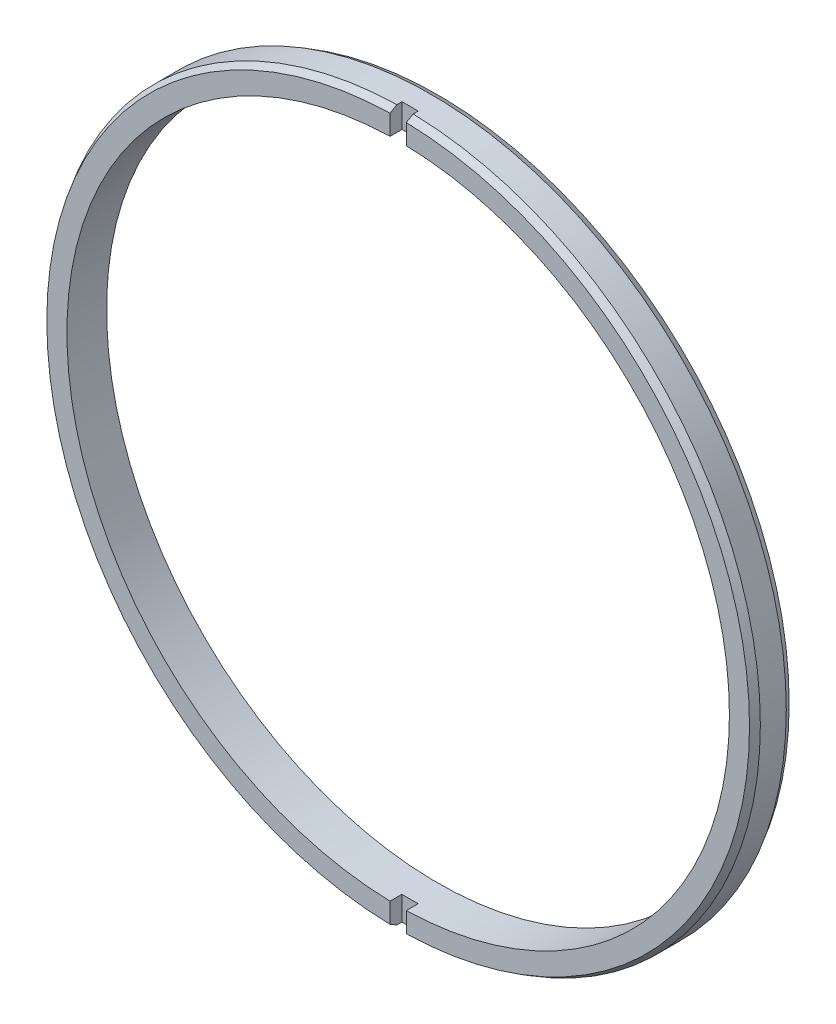
ISO-10303-21;
HEADER;
FILE_DESCRIPTION(('STEP AP214'),'2;1');
FILE_NAME('part.step','',(''),(''),'','','');
FILE_SCHEMA(('AUTOMOTIVE_DESIGN { 1 0 10303 214 1 1 1 1 }'));
ENDSEC;
DATA;
#1=APPLICATION_CONTEXT('core data for automotive mechanical design processes');
#2=APPLICATION_PROTOCOL_DEFINITION('international standard','automotive_design',2000,#1);
#3=PRODUCT_CONTEXT('',#1,'mechanical');
#4=PRODUCT('Part','Part','',(#3));
#5=PRODUCT_RELATED_PRODUCT_CATEGORY('part','',(#4));
#6=PRODUCT_DEFINITION_FORMATION('','',#4);
#7=PRODUCT_DEFINITION_CONTEXT('part definition',#1,'design');
#8=PRODUCT_DEFINITION('design','',#6,#7);
#9=PRODUCT_DEFINITION_SHAPE('','',#8);
#10=(LENGTH_UNIT() NAMED_UNIT(*) SI_UNIT(.MILLI.,.METRE.));
#11=(NAMED_UNIT(*) PLANE_ANGLE_UNIT() SI_UNIT($,.RADIAN.));
#12=(NAMED_UNIT(*) SI_UNIT($,.STERADIAN.) SOLID_ANGLE_UNIT());
#13=UNCERTAINTY_MEASURE_WITH_UNIT(LENGTH_MEASURE(1.E-05),#10,'distance_accuracy_value','');
#14=(GEOMETRIC_REPRESENTATION_CONTEXT(3) GLOBAL_UNCERTAINTY_ASSIGNED_CONTEXT((#13)) GLOBAL_UNIT_ASSIGNED_CONTEXT((#10,
#11,#12)) REPRESENTATION_CONTEXT('',''));
#15=CARTESIAN_POINT('',(0.,0.,0.));
#16=DIRECTION('',(0.,0.,1.));
#17=DIRECTION('',(1.,0.,0.));
#18=AXIS2_PLACEMENT_3D('',#15,#16,#17);
#19=CARTESIAN_POINT('',(0.,0.,0.));
#20=DIRECTION('',(0.,0.,1.));
#21=DIRECTION('',(1.,0.,0.));
#22=AXIS2_PLACEMENT_3D('',#19,#20,#21);
#23=PLANE('',#22);
#24=DIRECTION('',(0.,1.,0.));
#25=VECTOR('',#24,1.);
#26=CARTESIAN_POINT('',(0.5207,22.9971254303368,0.));
#27=LINE('',#26,#25);
#28=CARTESIAN_POINT('',(0.520700000000006,-22.4899730437811,0.));
#29=VERTEX_POINT('',#28);
#30=CARTESIAN_POINT('',(0.520700000000005,-21.2026072101994,0.));
#31=VERTEX_POINT('',#30);
#32=EDGE_CURVE('E247',#29,#31,#27,.T.);
#33=ORIENTED_EDGE('',*,*,#32,.F.);
#34=CARTESIAN_POINT('',(0.,0.,0.));
#35=DIRECTION('',(0.,0.,1.));
#36=DIRECTION('',(1.,0.,0.));
#37=AXIS2_PLACEMENT_3D('',#34,#35,#36);
#38=CIRCLE('',#37,22.496);
#39=CARTESIAN_POINT('',(0.5207,22.4899730437811,0.));
#40=VERTEX_POINT('',#39);
#41=EDGE_CURVE('E135',#29,#40,#38,.T.);
#42=ORIENTED_EDGE('',*,*,#41,.T.);
#43=CARTESIAN_POINT('',(0.5207,21.2026072101994,0.));
#44=VERTEX_POINT('',#43);
#45=EDGE_CURVE('E101',#44,#40,#27,.T.);
#46=ORIENTED_EDGE('',*,*,#45,.F.);
#47=CARTESIAN_POINT('',(0.,0.,0.));
#48=DIRECTION('',(0.,0.,1.));
#49=DIRECTION('',(1.,0.,0.));
#50=AXIS2_PLACEMENT_3D('',#47,#48,#49);
#51=CIRCLE('',#50,21.209);
#52=EDGE_CURVE('E119',#31,#44,#51,.T.);
#53=ORIENTED_EDGE('',*,*,#52,.F.);
#54=EDGE_LOOP('',(#33,#42,#46,#53));
#55=FACE_BOUND('',#54,.T.);
#56=ADVANCED_FACE('F16',(#55),#23,.T.);
#57=CARTESIAN_POINT('',(0.,0.,-2.54));
#58=DIRECTION('',(0.,0.,1.));
#59=DIRECTION('',(1.,0.,0.));
#60=AXIS2_PLACEMENT_3D('',#57,#58,#59);
#61=CYLINDRICAL_SURFACE('',#60,22.75);
#62=CARTESIAN_POINT('',(0.,0.,-2.10005909487751));
#63=DIRECTION('',(0.,0.,1.));
#64=DIRECTION('',(1.,0.,0.));
#65=AXIS2_PLACEMENT_3D('',#62,#63,#64);
#66=CIRCLE('',#65,22.75);
#67=CARTESIAN_POINT('',(22.75,0.,-2.10005909487751));
#68=VERTEX_POINT('',#67);
#69=EDGE_CURVE('E24',#68,#68,#66,.T.);
#70=ORIENTED_EDGE('',*,*,#69,.T.);
#71=EDGE_LOOP('',(#70));
#72=FACE_BOUND('',#71,.T.);
#73=DIRECTION('',(0.,0.,1.));
#74=VECTOR('',#73,1.);
#75=CARTESIAN_POINT('',(0.5207,22.7440403514855,-2.54));
#76=LINE('',#75,#74);
#77=CARTESIAN_POINT('',(0.5207,22.7440403514855,-0.439940905122491));
#78=VERTEX_POINT('',#77);
#79=CARTESIAN_POINT('',(0.5207,22.7440403514855,-0.762));
#80=VERTEX_POINT('',#79);
#81=EDGE_CURVE('E124',#78,#80,#76,.F.);
#82=ORIENTED_EDGE('',*,*,#81,.F.);
#83=CARTESIAN_POINT('',(0.,0.,-0.439940905122491));
#84=DIRECTION('',(0.,0.,1.));
#85=DIRECTION('',(1.,0.,0.));
#86=AXIS2_PLACEMENT_3D('',#83,#84,#85);
#87=CIRCLE('',#86,22.75);
#88=CARTESIAN_POINT('',(0.520700000000005,-22.7440403514855,-0.439940905122486));
#89=VERTEX_POINT('',#88);
#90=EDGE_CURVE('E171',#78,#89,#87,.F.);
#91=ORIENTED_EDGE('',*,*,#90,.T.);
#92=DIRECTION('',(0.,0.,1.));
#93=VECTOR('',#92,1.);
#94=CARTESIAN_POINT('',(0.520700000000005,-22.7440403514855,-2.54));
#95=LINE('',#94,#93);
#96=CARTESIAN_POINT('',(0.520700000000006,-22.7440403514855,-0.762));
#97=VERTEX_POINT('',#96);
#98=EDGE_CURVE('E229',#97,#89,#95,.T.);
#99=ORIENTED_EDGE('',*,*,#98,.F.);
#100=CARTESIAN_POINT('',(0.,0.,-0.762));
#101=DIRECTION('',(0.,0.,1.));
#102=DIRECTION('',(1.,0.,0.));
#103=AXIS2_PLACEMENT_3D('',#100,#101,#102);
#104=CIRCLE('',#103,22.75);
#105=CARTESIAN_POINT('',(-0.520699999999994,-22.7440403514855,-0.762));
#106=VERTEX_POINT('',#105);
#107=EDGE_CURVE('E237',#97,#106,#104,.F.);
#108=ORIENTED_EDGE('',*,*,#107,.T.);
#109=DIRECTION('',(0.,0.,1.));
#110=VECTOR('',#109,1.);
#111=CARTESIAN_POINT('',(-0.520699999999994,-22.7440403514855,-2.54));
#112=LINE('',#111,#110);
#113=CARTESIAN_POINT('',(-0.520699999999994,-22.7440403514855,-0.439940905122491));
#114=VERTEX_POINT('',#113);
#115=EDGE_CURVE('E235',#114,#106,#112,.F.);
#116=ORIENTED_EDGE('',*,*,#115,.F.);
#117=CARTESIAN_POINT('',(0.,0.,-0.439940905122491));
#118=DIRECTION('',(0.,0.,1.));
#119=DIRECTION('',(1.,0.,0.));
#120=AXIS2_PLACEMENT_3D('',#117,#118,#119);
#121=CIRCLE('',#120,22.75);
#122=CARTESIAN_POINT('',(-0.5207,22.7440403514855,-0.439940905122486));
#123=VERTEX_POINT('',#122);
#124=EDGE_CURVE('E146',#114,#123,#121,.F.);
#125=ORIENTED_EDGE('',*,*,#124,.T.);
#126=DIRECTION('',(0.,0.,1.));
#127=VECTOR('',#126,1.);
#128=CARTESIAN_POINT('',(-0.5207,22.7440403514855,-2.54));
#129=LINE('',#128,#127);
#130=CARTESIAN_POINT('',(-0.5207,22.7440403514855,-0.762));
#131=VERTEX_POINT('',#130);
#132=EDGE_CURVE('E233',#131,#123,#129,.T.);
#133=ORIENTED_EDGE('',*,*,#132,.F.);
#134=EDGE_CURVE('E226',#131,#80,#104,.F.);
#135=ORIENTED_EDGE('',*,*,#134,.T.);
#136=EDGE_LOOP('',(#82,#91,#99,#108,#116,#125,#133,#135));
#137=FACE_BOUND('',#136,.T.);
#138=ADVANCED_FACE('F194',(#72,#137),#61,.T.);
#139=CARTESIAN_POINT('',(0.,0.,-2.54));
#140=DIRECTION('',(0.,0.,1.));
#141=DIRECTION('',(1.,0.,0.));
#142=AXIS2_PLACEMENT_3D('',#139,#140,#141);
#143=PLANE('',#142);
#144=CARTESIAN_POINT('',(0.,0.,-2.54));
#145=DIRECTION('',(0.,0.,1.));
#146=DIRECTION('',(1.,0.,0.));
#147=AXIS2_PLACEMENT_3D('',#144,#145,#146);
#148=CIRCLE('',#147,22.496);
#149=CARTESIAN_POINT('',(22.496,0.,-2.54));
#150=VERTEX_POINT('',#149);
#151=EDGE_CURVE('E11',#150,#150,#148,.F.);
#152=ORIENTED_EDGE('',*,*,#151,.T.);
#153=EDGE_LOOP('',(#152));
#154=FACE_BOUND('',#153,.T.);
#155=CARTESIAN_POINT('',(0.,0.,-2.54));
#156=DIRECTION('',(0.,0.,1.));
#157=DIRECTION('',(1.,0.,0.));
#158=AXIS2_PLACEMENT_3D('',#155,#156,#157);
#159=CIRCLE('',#158,21.209);
#160=CARTESIAN_POINT('',(21.209,0.,-2.54));
#161=VERTEX_POINT('',#160);
#162=EDGE_CURVE('E118',#161,#161,#159,.T.);
#163=ORIENTED_EDGE('',*,*,#162,.T.);
#164=EDGE_LOOP('',(#163));
#165=FACE_BOUND('',#164,.T.);
#166=ADVANCED_FACE('F200',(#154,#165),#143,.F.);
#167=DIRECTION('',(0.,-1.,0.));
#168=VECTOR('',#167,1.);
#169=CARTESIAN_POINT('',(-0.5207,22.9971254303368,0.));
#170=LINE('',#169,#168);
#171=CARTESIAN_POINT('',(-0.5207,22.4899730437811,0.));
#172=VERTEX_POINT('',#171);
#173=CARTESIAN_POINT('',(-0.5207,21.2026072101994,0.));
#174=VERTEX_POINT('',#173);
#175=EDGE_CURVE('E93',#172,#174,#170,.T.);
#176=ORIENTED_EDGE('',*,*,#175,.F.);
#177=CARTESIAN_POINT('',(0.,0.,0.));
#178=DIRECTION('',(0.,0.,1.));
#179=DIRECTION('',(1.,0.,0.));
#180=AXIS2_PLACEMENT_3D('',#177,#178,#179);
#181=CIRCLE('',#180,22.496);
#182=CARTESIAN_POINT('',(-0.520699999999994,-22.4899730437811,0.));
#183=VERTEX_POINT('',#182);
#184=EDGE_CURVE('E170',#172,#183,#181,.T.);
#185=ORIENTED_EDGE('',*,*,#184,.T.);
#186=CARTESIAN_POINT('',(-0.520699999999994,-21.2026072101994,0.));
#187=VERTEX_POINT('',#186);
#188=EDGE_CURVE('E102',#187,#183,#170,.T.);
#189=ORIENTED_EDGE('',*,*,#188,.F.);
#190=EDGE_CURVE('E110',#174,#187,#51,.T.);
#191=ORIENTED_EDGE('',*,*,#190,.F.);
#192=EDGE_LOOP('',(#176,#185,#189,#191));
#193=FACE_BOUND('',#192,.T.);
#194=ADVANCED_FACE('F116',(#193),#23,.T.);
#195=CARTESIAN_POINT('',(0.,0.,-2.54));
#196=DIRECTION('',(0.,0.,1.));
#197=DIRECTION('',(1.,0.,0.));
#198=AXIS2_PLACEMENT_3D('',#195,#196,#197);
#199=CYLINDRICAL_SURFACE('',#198,21.209);
#200=CARTESIAN_POINT('',(0.,0.,-0.762));
#201=DIRECTION('',(0.,0.,1.));
#202=DIRECTION('',(1.,0.,0.));
#203=AXIS2_PLACEMENT_3D('',#200,#201,#202);
#204=CIRCLE('',#203,21.209);
#205=CARTESIAN_POINT('',(0.520700000000005,-21.2026072101994,-0.762));
#206=VERTEX_POINT('',#205);
#207=CARTESIAN_POINT('',(-0.520699999999994,-21.2026072101994,-0.762));
#208=VERTEX_POINT('',#207);
#209=EDGE_CURVE('E127',#206,#208,#204,.F.);
#210=ORIENTED_EDGE('',*,*,#209,.F.);
#211=DIRECTION('',(0.,0.,1.));
#212=VECTOR('',#211,1.);
#213=CARTESIAN_POINT('',(0.520700000000005,-21.2026072101994,-2.54));
#214=LINE('',#213,#212);
#215=EDGE_CURVE('E132',#206,#31,#214,.T.);
#216=ORIENTED_EDGE('',*,*,#215,.T.);
#217=ORIENTED_EDGE('',*,*,#52,.T.);
#218=DIRECTION('',(0.,0.,1.));
#219=VECTOR('',#218,1.);
#220=CARTESIAN_POINT('',(0.5207,21.2026072101994,-2.54));
#221=LINE('',#220,#219);
#222=CARTESIAN_POINT('',(0.5207,21.2026072101994,-0.762));
#223=VERTEX_POINT('',#222);
#224=EDGE_CURVE('E113',#44,#223,#221,.F.);
#225=ORIENTED_EDGE('',*,*,#224,.T.);
#226=CARTESIAN_POINT('',(-0.5207,21.2026072101994,-0.762));
#227=VERTEX_POINT('',#226);
#228=EDGE_CURVE('E112',#227,#223,#204,.F.);
#229=ORIENTED_EDGE('',*,*,#228,.F.);
#230=DIRECTION('',(0.,0.,1.));
#231=VECTOR('',#230,1.);
#232=CARTESIAN_POINT('',(-0.520699999999999,21.2026072101994,-2.54));
#233=LINE('',#232,#231);
#234=EDGE_CURVE('E97',#227,#174,#233,.T.);
#235=ORIENTED_EDGE('',*,*,#234,.T.);
#236=ORIENTED_EDGE('',*,*,#190,.T.);
#237=DIRECTION('',(0.,0.,1.));
#238=VECTOR('',#237,1.);
#239=CARTESIAN_POINT('',(-0.520699999999994,-21.2026072101994,-2.54));
#240=LINE('',#239,#238);
#241=EDGE_CURVE('E130',#187,#208,#240,.F.);
#242=ORIENTED_EDGE('',*,*,#241,.T.);
#243=EDGE_LOOP('',(#210,#216,#217,#225,#229,#235,#236,#242));
#244=FACE_BOUND('',#243,.T.);
#245=ORIENTED_EDGE('',*,*,#162,.F.);
#246=EDGE_LOOP('',(#245));
#247=FACE_BOUND('',#246,.T.);
#248=ADVANCED_FACE('F107',(#244,#247),#199,.F.);
#249=CARTESIAN_POINT('',(-0.5207,22.9971254303368,-0.762));
#250=DIRECTION('',(0.,0.,1.));
#251=DIRECTION('',(1.,0.,0.));
#252=AXIS2_PLACEMENT_3D('',#249,#250,#251);
#253=PLANE('',#252);
#254=DIRECTION('',(0.,-1.,0.));
#255=VECTOR('',#254,1.);
#256=CARTESIAN_POINT('',(-0.5207,22.9971254303368,-0.762));
#257=LINE('',#256,#255);
#258=EDGE_CURVE('E236',#131,#227,#257,.T.);
#259=ORIENTED_EDGE('',*,*,#258,.T.);
#260=ORIENTED_EDGE('',*,*,#228,.T.);
#261=DIRECTION('',(0.,1.,0.));
#262=VECTOR('',#261,1.);
#263=CARTESIAN_POINT('',(0.5207,22.9971254303368,-0.762));
#264=LINE('',#263,#262);
#265=EDGE_CURVE('E243',#223,#80,#264,.T.);
#266=ORIENTED_EDGE('',*,*,#265,.T.);
#267=ORIENTED_EDGE('',*,*,#134,.F.);
#268=EDGE_LOOP('',(#259,#260,#266,#267));
#269=FACE_BOUND('',#268,.T.);
#270=ADVANCED_FACE('F209',(#269),#253,.T.);
#271=CARTESIAN_POINT('',(-0.5207,22.9971254303368,-0.762));
#272=DIRECTION('',(-1.,0.,0.));
#273=DIRECTION('',(0.,-1.,0.));
#274=AXIS2_PLACEMENT_3D('',#271,#272,#273);
#275=PLANE('',#274);
#276=ORIENTED_EDGE('',*,*,#132,.T.);
#277=CARTESIAN_POINT('',(-0.5207,22.7440403514855,-0.439940905122491));
#278=CARTESIAN_POINT('',(-0.5207,22.7016958946887,-0.366617366368694));
#279=CARTESIAN_POINT('',(-0.5207,22.6593513906483,-0.293293854898255));
#280=CARTESIAN_POINT('',(-0.5207,22.5746622880801,-0.146646886524091));
#281=CARTESIAN_POINT('',(-0.5207,22.5323176895524,-0.0733234296203661));
#282=CARTESIAN_POINT('',(-0.5207,22.4899730437811,0.));
#283=B_SPLINE_CURVE_WITH_KNOTS('',3,(#277,#278,#279,#280,#281,#282),.UNSPECIFIED.,.F.,.F.,(4,2,
4),(0.,0.254016828598158,0.508033657196317),.UNSPECIFIED.);
#284=EDGE_CURVE('E39',#123,#172,#283,.T.);
#285=ORIENTED_EDGE('',*,*,#284,.T.);
#286=ORIENTED_EDGE('',*,*,#175,.T.);
#287=ORIENTED_EDGE('',*,*,#234,.F.);
#288=ORIENTED_EDGE('',*,*,#258,.F.);
#289=EDGE_LOOP('',(#276,#285,#286,#287,#288));
#290=FACE_BOUND('',#289,.T.);
#291=ADVANCED_FACE('F95',(#290),#275,.F.);
#292=CARTESIAN_POINT('',(0.5207,22.9971254303368,-0.762));
#293=DIRECTION('',(1.,0.,0.));
#294=DIRECTION('',(0.,1.,0.));
#295=AXIS2_PLACEMENT_3D('',#292,#293,#294);
#296=PLANE('',#295);
#297=ORIENTED_EDGE('',*,*,#45,.T.);
#298=CARTESIAN_POINT('',(0.5207,22.4899730437811,0.));
#299=CARTESIAN_POINT('',(0.5207,22.5323176895524,-0.0733234296203669));
#300=CARTESIAN_POINT('',(0.5207,22.5746622880801,-0.146646886524091));
#301=CARTESIAN_POINT('',(0.5207,22.6593513906483,-0.293293854898255));
#302=CARTESIAN_POINT('',(0.5207,22.7016958946887,-0.366617366368694));
#303=CARTESIAN_POINT('',(0.5207,22.7440403514855,-0.43994090512249));
#304=B_SPLINE_CURVE_WITH_KNOTS('',3,(#298,#299,#300,#301,#302,#303),.UNSPECIFIED.,.F.,.F.,(4,2,
4),(0.,0.254016828598159,0.508033657196316),.UNSPECIFIED.);
#305=EDGE_CURVE('E138',#40,#78,#304,.T.);
#306=ORIENTED_EDGE('',*,*,#305,.T.);
#307=ORIENTED_EDGE('',*,*,#81,.T.);
#308=ORIENTED_EDGE('',*,*,#265,.F.);
#309=ORIENTED_EDGE('',*,*,#224,.F.);
#310=EDGE_LOOP('',(#297,#306,#307,#308,#309));
#311=FACE_BOUND('',#310,.T.);
#312=ADVANCED_FACE('F151',(#311),#296,.F.);
#313=ORIENTED_EDGE('',*,*,#98,.T.);
#314=CARTESIAN_POINT('',(0.520700000000006,-22.7440403514855,-0.439940905122491));
#315=CARTESIAN_POINT('',(0.520700000000006,-22.7016958946887,-0.366617366368694));
#316=CARTESIAN_POINT('',(0.520700000000006,-22.6593513906483,-0.293293854898255));
#317=CARTESIAN_POINT('',(0.520700000000006,-22.5746622880801,-0.146646886524091));
#318=CARTESIAN_POINT('',(0.520700000000006,-22.5323176895524,-0.0733234296203661));
#319=CARTESIAN_POINT('',(0.520700000000006,-22.4899730437811,0.));
#320=B_SPLINE_CURVE_WITH_KNOTS('',3,(#314,#315,#316,#317,#318,#319),.UNSPECIFIED.,.F.,.F.,(4,2,
4),(0.,0.254016828598158,0.508033657196317),.UNSPECIFIED.);
#321=EDGE_CURVE('E164',#89,#29,#320,.T.);
#322=ORIENTED_EDGE('',*,*,#321,.T.);
#323=ORIENTED_EDGE('',*,*,#32,.T.);
#324=ORIENTED_EDGE('',*,*,#215,.F.);
#325=EDGE_CURVE('E248',#97,#206,#264,.T.);
#326=ORIENTED_EDGE('',*,*,#325,.F.);
#327=EDGE_LOOP('',(#313,#322,#323,#324,#326));
#328=FACE_BOUND('',#327,.T.);
#329=ADVANCED_FACE('F156',(#328),#296,.F.);
#330=ORIENTED_EDGE('',*,*,#188,.T.);
#331=CARTESIAN_POINT('',(-0.520699999999994,-22.4899730437811,0.));
#332=CARTESIAN_POINT('',(-0.520699999999994,-22.5323176895524,-0.0733234296203669));
#333=CARTESIAN_POINT('',(-0.520699999999994,-22.5746622880801,-0.146646886524091));
#334=CARTESIAN_POINT('',(-0.520699999999994,-22.6593513906483,-0.293293854898255));
#335=CARTESIAN_POINT('',(-0.520699999999994,-22.7016958946887,-0.366617366368694));
#336=CARTESIAN_POINT('',(-0.520699999999994,-22.7440403514855,-0.43994090512249));
#337=B_SPLINE_CURVE_WITH_KNOTS('',3,(#331,#332,#333,#334,#335,#336),.UNSPECIFIED.,.F.,.F.,(4,2,
4),(0.,0.254016828598159,0.508033657196316),.UNSPECIFIED.);
#338=EDGE_CURVE('E31',#183,#114,#337,.T.);
#339=ORIENTED_EDGE('',*,*,#338,.T.);
#340=ORIENTED_EDGE('',*,*,#115,.T.);
#341=EDGE_CURVE('E256',#208,#106,#257,.T.);
#342=ORIENTED_EDGE('',*,*,#341,.F.);
#343=ORIENTED_EDGE('',*,*,#241,.F.);
#344=EDGE_LOOP('',(#330,#339,#340,#342,#343));
#345=FACE_BOUND('',#344,.T.);
#346=ADVANCED_FACE('F159',(#345),#275,.F.);
#347=ORIENTED_EDGE('',*,*,#325,.T.);
#348=ORIENTED_EDGE('',*,*,#209,.T.);
#349=ORIENTED_EDGE('',*,*,#341,.T.);
#350=ORIENTED_EDGE('',*,*,#107,.F.);
#351=EDGE_LOOP('',(#347,#348,#349,#350));
#352=FACE_BOUND('',#351,.T.);
#353=ADVANCED_FACE('F158',(#352),#253,.T.);
#354=CARTESIAN_POINT('',(0.,0.,0.));
#355=DIRECTION('',(0.,0.,-1.));
#356=DIRECTION('',(-1.,0.,0.));
#357=AXIS2_PLACEMENT_3D('',#354,#355,#356);
#358=CONICAL_SURFACE('',#357,22.496,0.523598775598304);
#359=ORIENTED_EDGE('',*,*,#321,.F.);
#360=ORIENTED_EDGE('',*,*,#90,.F.);
#361=ORIENTED_EDGE('',*,*,#305,.F.);
#362=ORIENTED_EDGE('',*,*,#41,.F.);
#363=EDGE_LOOP('',(#359,#360,#361,#362));
#364=FACE_BOUND('',#363,.T.);
#365=ADVANCED_FACE('F148',(#364),#358,.T.);
#366=CARTESIAN_POINT('',(0.,0.,0.));
#367=DIRECTION('',(0.,0.,-1.));
#368=DIRECTION('',(-1.,0.,0.));
#369=AXIS2_PLACEMENT_3D('',#366,#367,#368);
#370=CONICAL_SURFACE('',#369,22.496,0.523598775598304);
#371=ORIENTED_EDGE('',*,*,#284,.F.);
#372=ORIENTED_EDGE('',*,*,#124,.F.);
#373=ORIENTED_EDGE('',*,*,#338,.F.);
#374=ORIENTED_EDGE('',*,*,#184,.F.);
#375=EDGE_LOOP('',(#371,#372,#373,#374));
#376=FACE_BOUND('',#375,.T.);
#377=ADVANCED_FACE('F182',(#376),#370,.T.);
#378=CARTESIAN_POINT('',(0.,0.,-2.10005909487751));
#379=DIRECTION('',(0.,0.,1.));
#380=DIRECTION('',(1.,0.,0.));
#381=AXIS2_PLACEMENT_3D('',#378,#379,#380);
#382=CONICAL_SURFACE('',#381,22.75,0.523598775598304);
#383=ORIENTED_EDGE('',*,*,#151,.F.);
#384=EDGE_LOOP('',(#383));
#385=FACE_BOUND('',#384,.T.);
#386=ORIENTED_EDGE('',*,*,#69,.F.);
#387=EDGE_LOOP('',(#386));
#388=FACE_BOUND('',#387,.T.);
#389=ADVANCED_FACE('F18',(#385,#388),#382,.T.);
#390=CLOSED_SHELL('',(#56,#138,#166,#194,#248,#270,#291,#312,#329,#346,#353,#365,#377,#389));
#391=MANIFOLD_SOLID_BREP('B1',#390);
#392=ADVANCED_BREP_SHAPE_REPRESENTATION('',(#18,#391),#14);
#393=SHAPE_DEFINITION_REPRESENTATION(#9,#392);
ENDSEC;
END-ISO-10303-21;
